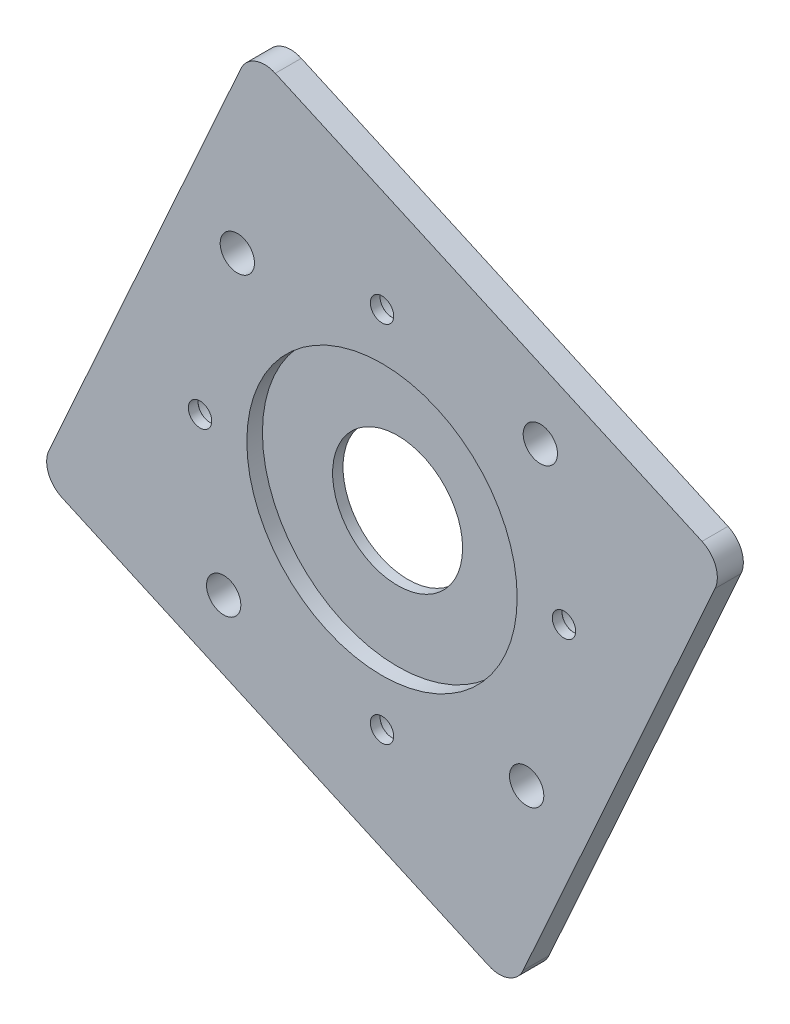
ISO-10303-21;
HEADER;
FILE_DESCRIPTION(('STEP AP214'),'2;1');
FILE_NAME('part.step','',(''),(''),'','','');
FILE_SCHEMA(('AUTOMOTIVE_DESIGN { 1 0 10303 214 1 1 1 1 }'));
ENDSEC;
DATA;
#1=APPLICATION_CONTEXT('core data for automotive mechanical design processes');
#2=APPLICATION_PROTOCOL_DEFINITION('international standard','automotive_design',2000,#1);
#3=PRODUCT_CONTEXT('',#1,'mechanical');
#4=PRODUCT('Part','Part','',(#3));
#5=PRODUCT_RELATED_PRODUCT_CATEGORY('part','',(#4));
#6=PRODUCT_DEFINITION_FORMATION('','',#4);
#7=PRODUCT_DEFINITION_CONTEXT('part definition',#1,'design');
#8=PRODUCT_DEFINITION('design','',#6,#7);
#9=PRODUCT_DEFINITION_SHAPE('','',#8);
#10=(LENGTH_UNIT() NAMED_UNIT(*) SI_UNIT(.MILLI.,.METRE.));
#11=(NAMED_UNIT(*) PLANE_ANGLE_UNIT() SI_UNIT($,.RADIAN.));
#12=(NAMED_UNIT(*) SI_UNIT($,.STERADIAN.) SOLID_ANGLE_UNIT());
#13=UNCERTAINTY_MEASURE_WITH_UNIT(LENGTH_MEASURE(1.E-05),#10,'distance_accuracy_value','');
#14=(GEOMETRIC_REPRESENTATION_CONTEXT(3) GLOBAL_UNCERTAINTY_ASSIGNED_CONTEXT((#13)) GLOBAL_UNIT_ASSIGNED_CONTEXT((#10,
#11,#12)) REPRESENTATION_CONTEXT('',''));
#15=CARTESIAN_POINT('',(0.,0.,0.));
#16=DIRECTION('',(0.,0.,1.));
#17=DIRECTION('',(1.,0.,0.));
#18=AXIS2_PLACEMENT_3D('',#15,#16,#17);
#19=CARTESIAN_POINT('',(0.,0.,5.));
#20=DIRECTION('',(0.,0.,1.));
#21=DIRECTION('',(1.,0.,0.));
#22=AXIS2_PLACEMENT_3D('',#19,#20,#21);
#23=PLANE('',#22);
#24=CARTESIAN_POINT('',(30.4526604909076,27.8244131838484,5.));
#25=DIRECTION('',(0.,0.,1.));
#26=DIRECTION('',(1.,0.,0.));
#27=AXIS2_PLACEMENT_3D('',#24,#25,#26);
#28=CIRCLE('',#27,3.29999999999998);
#29=CARTESIAN_POINT('',(33.7526604909076,27.8244131838484,5.));
#30=VERTEX_POINT('',#29);
#31=EDGE_CURVE('E203',#30,#30,#28,.T.);
#32=ORIENTED_EDGE('',*,*,#31,.F.);
#33=EDGE_LOOP('',(#32));
#34=FACE_BOUND('',#33,.T.);
#35=CARTESIAN_POINT('',(-27.8244131838484,30.4526604909076,5.));
#36=DIRECTION('',(0.,0.,1.));
#37=DIRECTION('',(1.,0.,0.));
#38=AXIS2_PLACEMENT_3D('',#35,#36,#37);
#39=CIRCLE('',#38,3.29999999999999);
#40=CARTESIAN_POINT('',(-24.5244131838484,30.4526604909076,5.));
#41=VERTEX_POINT('',#40);
#42=EDGE_CURVE('E210',#41,#41,#39,.T.);
#43=ORIENTED_EDGE('',*,*,#42,.F.);
#44=EDGE_LOOP('',(#43));
#45=FACE_BOUND('',#44,.T.);
#46=CARTESIAN_POINT('',(-30.4526604909076,-27.8244131838484,5.));
#47=DIRECTION('',(0.,0.,1.));
#48=DIRECTION('',(1.,0.,0.));
#49=AXIS2_PLACEMENT_3D('',#46,#47,#48);
#50=CIRCLE('',#49,3.29999999999999);
#51=CARTESIAN_POINT('',(-27.1526604909076,-27.8244131838484,5.));
#52=VERTEX_POINT('',#51);
#53=EDGE_CURVE('E216',#52,#52,#50,.T.);
#54=ORIENTED_EDGE('',*,*,#53,.F.);
#55=EDGE_LOOP('',(#54));
#56=FACE_BOUND('',#55,.T.);
#57=CARTESIAN_POINT('',(27.8244131838484,-30.4526604909076,5.));
#58=DIRECTION('',(0.,0.,1.));
#59=DIRECTION('',(1.,0.,0.));
#60=AXIS2_PLACEMENT_3D('',#57,#58,#59);
#61=CIRCLE('',#60,3.29999999999999);
#62=CARTESIAN_POINT('',(31.1244131838484,-30.4526604909076,5.));
#63=VERTEX_POINT('',#62);
#64=EDGE_CURVE('E222',#63,#63,#61,.T.);
#65=ORIENTED_EDGE('',*,*,#64,.F.);
#66=EDGE_LOOP('',(#65));
#67=FACE_BOUND('',#66,.T.);
#68=CARTESIAN_POINT('',(0.,35.,5.));
#69=DIRECTION('',(0.,0.,-1.));
#70=DIRECTION('',(-1.,0.,0.));
#71=AXIS2_PLACEMENT_3D('',#68,#69,#70);
#72=CIRCLE('',#71,2.25);
#73=CARTESIAN_POINT('',(-2.25,35.,5.));
#74=VERTEX_POINT('',#73);
#75=EDGE_CURVE('E240',#74,#74,#72,.T.);
#76=ORIENTED_EDGE('',*,*,#75,.T.);
#77=EDGE_LOOP('',(#76));
#78=FACE_BOUND('',#77,.T.);
#79=CARTESIAN_POINT('',(-35.,0.,5.));
#80=DIRECTION('',(0.,0.,-1.));
#81=DIRECTION('',(-1.,0.,0.));
#82=AXIS2_PLACEMENT_3D('',#79,#80,#81);
#83=CIRCLE('',#82,2.25);
#84=CARTESIAN_POINT('',(-37.25,0.,5.));
#85=VERTEX_POINT('',#84);
#86=EDGE_CURVE('E255',#85,#85,#83,.T.);
#87=ORIENTED_EDGE('',*,*,#86,.T.);
#88=EDGE_LOOP('',(#87));
#89=FACE_BOUND('',#88,.T.);
#90=CARTESIAN_POINT('',(0.,-35.,5.));
#91=DIRECTION('',(0.,0.,-1.));
#92=DIRECTION('',(-1.,0.,0.));
#93=AXIS2_PLACEMENT_3D('',#90,#91,#92);
#94=CIRCLE('',#93,2.25);
#95=CARTESIAN_POINT('',(-2.25,-35.,5.));
#96=VERTEX_POINT('',#95);
#97=EDGE_CURVE('E270',#96,#96,#94,.T.);
#98=ORIENTED_EDGE('',*,*,#97,.T.);
#99=EDGE_LOOP('',(#98));
#100=FACE_BOUND('',#99,.T.);
#101=CARTESIAN_POINT('',(35.,0.,5.));
#102=DIRECTION('',(0.,0.,-1.));
#103=DIRECTION('',(-1.,0.,0.));
#104=AXIS2_PLACEMENT_3D('',#101,#102,#103);
#105=CIRCLE('',#104,2.25);
#106=CARTESIAN_POINT('',(32.75,0.,5.));
#107=VERTEX_POINT('',#106);
#108=EDGE_CURVE('E285',#107,#107,#105,.T.);
#109=ORIENTED_EDGE('',*,*,#108,.T.);
#110=EDGE_LOOP('',(#109));
#111=FACE_BOUND('',#110,.T.);
#112=CARTESIAN_POINT('',(0.,0.,5.));
#113=DIRECTION('',(0.,0.,1.));
#114=DIRECTION('',(1.,0.,0.));
#115=AXIS2_PLACEMENT_3D('',#112,#113,#114);
#116=CIRCLE('',#115,26.);
#117=CARTESIAN_POINT('',(26.,0.,5.));
#118=VERTEX_POINT('',#117);
#119=EDGE_CURVE('E119',#118,#118,#116,.T.);
#120=ORIENTED_EDGE('',*,*,#119,.F.);
#121=EDGE_LOOP('',(#120));
#122=FACE_BOUND('',#121,.T.);
#123=DIRECTION('',(-0.91197329592772,0.410249567354717,0.));
#124=VECTOR('',#123,1.);
#125=CARTESIAN_POINT('',(-20.5124783677358,-45.598664796386,5.));
#126=LINE('',#125,#124);
#127=CARTESIAN_POINT('',(20.5263199490115,-64.0598953273482,5.));
#128=VERTEX_POINT('',#127);
#129=CARTESIAN_POINT('',(-61.5512766844832,-27.1374342654237,5.));
#130=VERTEX_POINT('',#129);
#131=EDGE_CURVE('E187',#128,#130,#126,.T.);
#132=ORIENTED_EDGE('',*,*,#131,.F.);
#133=CARTESIAN_POINT('',(22.5775677857851,-59.5000288477096,5.));
#134=DIRECTION('',(0.,0.,-1.));
#135=DIRECTION('',(-1.,0.,0.));
#136=AXIS2_PLACEMENT_3D('',#133,#134,#135);
#137=CIRCLE('',#136,4.99999999999999);
#138=CARTESIAN_POINT('',(27.1374342654237,-61.5512766844832,5.));
#139=VERTEX_POINT('',#138);
#140=EDGE_CURVE('E387',#139,#128,#137,.T.);
#141=ORIENTED_EDGE('',*,*,#140,.F.);
#142=DIRECTION('',(-0.410249567354716,-0.91197329592772,0.));
#143=VECTOR('',#142,1.);
#144=CARTESIAN_POINT('',(45.598664796386,-20.5124783677358,5.));
#145=LINE('',#144,#143);
#146=CARTESIAN_POINT('',(64.0598953273482,20.5263199490115,5.));
#147=VERTEX_POINT('',#146);
#148=EDGE_CURVE('E383',#147,#139,#145,.T.);
#149=ORIENTED_EDGE('',*,*,#148,.F.);
#150=CARTESIAN_POINT('',(59.5000288477096,22.5775677857851,5.));
#151=DIRECTION('',(0.,0.,-1.));
#152=DIRECTION('',(-1.,0.,0.));
#153=AXIS2_PLACEMENT_3D('',#150,#151,#152);
#154=CIRCLE('',#153,4.99999999999999);
#155=CARTESIAN_POINT('',(61.5512766844832,27.1374342654237,5.));
#156=VERTEX_POINT('',#155);
#157=EDGE_CURVE('E178',#156,#147,#154,.T.);
#158=ORIENTED_EDGE('',*,*,#157,.F.);
#159=DIRECTION('',(0.91197329592772,-0.410249567354717,0.));
#160=VECTOR('',#159,1.);
#161=CARTESIAN_POINT('',(20.5124783677358,45.598664796386,5.));
#162=LINE('',#161,#160);
#163=CARTESIAN_POINT('',(-20.5263199490115,64.0598953273482,5.));
#164=VERTEX_POINT('',#163);
#165=EDGE_CURVE('E164',#164,#156,#162,.T.);
#166=ORIENTED_EDGE('',*,*,#165,.F.);
#167=CARTESIAN_POINT('',(-22.5775677857851,59.5000288477096,5.));
#168=DIRECTION('',(0.,0.,-1.));
#169=DIRECTION('',(-1.,0.,0.));
#170=AXIS2_PLACEMENT_3D('',#167,#168,#169);
#171=CIRCLE('',#170,5.);
#172=CARTESIAN_POINT('',(-27.1374342654237,61.5512766844832,5.));
#173=VERTEX_POINT('',#172);
#174=EDGE_CURVE('E170',#173,#164,#171,.T.);
#175=ORIENTED_EDGE('',*,*,#174,.F.);
#176=DIRECTION('',(0.410249567354717,0.91197329592772,0.));
#177=VECTOR('',#176,1.);
#178=CARTESIAN_POINT('',(-45.598664796386,20.5124783677358,5.));
#179=LINE('',#178,#177);
#180=CARTESIAN_POINT('',(-64.0598953273482,-20.5263199490115,5.));
#181=VERTEX_POINT('',#180);
#182=EDGE_CURVE('E193',#181,#173,#179,.T.);
#183=ORIENTED_EDGE('',*,*,#182,.F.);
#184=CARTESIAN_POINT('',(-59.5000288477096,-22.5775677857851,5.));
#185=DIRECTION('',(0.,0.,-1.));
#186=DIRECTION('',(-1.,0.,0.));
#187=AXIS2_PLACEMENT_3D('',#184,#185,#186);
#188=CIRCLE('',#187,5.);
#189=EDGE_CURVE('E189',#130,#181,#188,.T.);
#190=ORIENTED_EDGE('',*,*,#189,.F.);
#191=EDGE_LOOP('',(#132,#141,#149,#158,#166,#175,#183,#190));
#192=FACE_BOUND('',#191,.T.);
#193=ADVANCED_FACE('F109',(#34,#45,#56,#67,#78,#89,#100,#111,#122,#192),#23,.T.);
#194=CARTESIAN_POINT('',(0.,0.,0.));
#195=DIRECTION('',(0.,0.,1.));
#196=DIRECTION('',(1.,0.,0.));
#197=AXIS2_PLACEMENT_3D('',#194,#195,#196);
#198=PLANE('',#197);
#199=CARTESIAN_POINT('',(30.4526604909076,27.8244131838484,0.));
#200=DIRECTION('',(0.,0.,1.));
#201=DIRECTION('',(1.,0.,0.));
#202=AXIS2_PLACEMENT_3D('',#199,#200,#201);
#203=CIRCLE('',#202,3.29999999999998);
#204=CARTESIAN_POINT('',(33.7526604909076,27.8244131838484,0.));
#205=VERTEX_POINT('',#204);
#206=EDGE_CURVE('E207',#205,#205,#203,.T.);
#207=ORIENTED_EDGE('',*,*,#206,.T.);
#208=EDGE_LOOP('',(#207));
#209=FACE_BOUND('',#208,.T.);
#210=CARTESIAN_POINT('',(-27.8244131838484,30.4526604909076,0.));
#211=DIRECTION('',(0.,0.,1.));
#212=DIRECTION('',(1.,0.,0.));
#213=AXIS2_PLACEMENT_3D('',#210,#211,#212);
#214=CIRCLE('',#213,3.29999999999999);
#215=CARTESIAN_POINT('',(-24.5244131838484,30.4526604909076,0.));
#216=VERTEX_POINT('',#215);
#217=EDGE_CURVE('E213',#216,#216,#214,.T.);
#218=ORIENTED_EDGE('',*,*,#217,.T.);
#219=EDGE_LOOP('',(#218));
#220=FACE_BOUND('',#219,.T.);
#221=CARTESIAN_POINT('',(-30.4526604909076,-27.8244131838484,0.));
#222=DIRECTION('',(0.,0.,1.));
#223=DIRECTION('',(1.,0.,0.));
#224=AXIS2_PLACEMENT_3D('',#221,#222,#223);
#225=CIRCLE('',#224,3.29999999999999);
#226=CARTESIAN_POINT('',(-27.1526604909076,-27.8244131838484,0.));
#227=VERTEX_POINT('',#226);
#228=EDGE_CURVE('E219',#227,#227,#225,.T.);
#229=ORIENTED_EDGE('',*,*,#228,.T.);
#230=EDGE_LOOP('',(#229));
#231=FACE_BOUND('',#230,.T.);
#232=CARTESIAN_POINT('',(27.8244131838484,-30.4526604909076,0.));
#233=DIRECTION('',(0.,0.,1.));
#234=DIRECTION('',(1.,0.,0.));
#235=AXIS2_PLACEMENT_3D('',#232,#233,#234);
#236=CIRCLE('',#235,3.29999999999999);
#237=CARTESIAN_POINT('',(31.1244131838484,-30.4526604909076,0.));
#238=VERTEX_POINT('',#237);
#239=EDGE_CURVE('E225',#238,#238,#236,.T.);
#240=ORIENTED_EDGE('',*,*,#239,.T.);
#241=EDGE_LOOP('',(#240));
#242=FACE_BOUND('',#241,.T.);
#243=CARTESIAN_POINT('',(0.,35.,0.));
#244=DIRECTION('',(0.,0.,-1.));
#245=DIRECTION('',(-1.,0.,0.));
#246=AXIS2_PLACEMENT_3D('',#243,#244,#245);
#247=CIRCLE('',#246,4.5);
#248=CARTESIAN_POINT('',(-4.5,35.,0.));
#249=VERTEX_POINT('',#248);
#250=EDGE_CURVE('E228',#249,#249,#247,.T.);
#251=ORIENTED_EDGE('',*,*,#250,.F.);
#252=EDGE_LOOP('',(#251));
#253=FACE_BOUND('',#252,.T.);
#254=CARTESIAN_POINT('',(-35.,0.,0.));
#255=DIRECTION('',(0.,0.,-1.));
#256=DIRECTION('',(-1.,0.,0.));
#257=AXIS2_PLACEMENT_3D('',#254,#255,#256);
#258=CIRCLE('',#257,4.5);
#259=CARTESIAN_POINT('',(-39.5,0.,0.));
#260=VERTEX_POINT('',#259);
#261=EDGE_CURVE('E243',#260,#260,#258,.T.);
#262=ORIENTED_EDGE('',*,*,#261,.F.);
#263=EDGE_LOOP('',(#262));
#264=FACE_BOUND('',#263,.T.);
#265=CARTESIAN_POINT('',(0.,-35.,0.));
#266=DIRECTION('',(0.,0.,-1.));
#267=DIRECTION('',(-1.,0.,0.));
#268=AXIS2_PLACEMENT_3D('',#265,#266,#267);
#269=CIRCLE('',#268,4.5);
#270=CARTESIAN_POINT('',(-4.5,-35.,0.));
#271=VERTEX_POINT('',#270);
#272=EDGE_CURVE('E258',#271,#271,#269,.T.);
#273=ORIENTED_EDGE('',*,*,#272,.F.);
#274=EDGE_LOOP('',(#273));
#275=FACE_BOUND('',#274,.T.);
#276=CARTESIAN_POINT('',(35.,0.,0.));
#277=DIRECTION('',(0.,0.,-1.));
#278=DIRECTION('',(-1.,0.,0.));
#279=AXIS2_PLACEMENT_3D('',#276,#277,#278);
#280=CIRCLE('',#279,4.5);
#281=CARTESIAN_POINT('',(30.5,0.,0.));
#282=VERTEX_POINT('',#281);
#283=EDGE_CURVE('E273',#282,#282,#280,.T.);
#284=ORIENTED_EDGE('',*,*,#283,.F.);
#285=EDGE_LOOP('',(#284));
#286=FACE_BOUND('',#285,.T.);
#287=CARTESIAN_POINT('',(0.,0.,0.));
#288=DIRECTION('',(0.,0.,1.));
#289=DIRECTION('',(1.,0.,0.));
#290=AXIS2_PLACEMENT_3D('',#287,#288,#289);
#291=CIRCLE('',#290,12.5);
#292=CARTESIAN_POINT('',(12.5,0.,0.));
#293=VERTEX_POINT('',#292);
#294=EDGE_CURVE('E288',#293,#293,#291,.T.);
#295=ORIENTED_EDGE('',*,*,#294,.T.);
#296=EDGE_LOOP('',(#295));
#297=FACE_BOUND('',#296,.T.);
#298=DIRECTION('',(-0.410249567354716,-0.91197329592772,0.));
#299=VECTOR('',#298,1.);
#300=CARTESIAN_POINT('',(45.598664796386,-20.5124783677358,0.));
#301=LINE('',#300,#299);
#302=CARTESIAN_POINT('',(64.0598953273482,20.5263199490115,0.));
#303=VERTEX_POINT('',#302);
#304=CARTESIAN_POINT('',(27.1374342654237,-61.5512766844832,0.));
#305=VERTEX_POINT('',#304);
#306=EDGE_CURVE('E366',#303,#305,#301,.T.);
#307=ORIENTED_EDGE('',*,*,#306,.T.);
#308=CARTESIAN_POINT('',(22.5775677857851,-59.5000288477096,0.));
#309=DIRECTION('',(0.,0.,-1.));
#310=DIRECTION('',(-1.,0.,0.));
#311=AXIS2_PLACEMENT_3D('',#308,#309,#310);
#312=CIRCLE('',#311,4.99999999999999);
#313=CARTESIAN_POINT('',(20.5263199490115,-64.0598953273482,0.));
#314=VERTEX_POINT('',#313);
#315=EDGE_CURVE('E370',#305,#314,#312,.T.);
#316=ORIENTED_EDGE('',*,*,#315,.T.);
#317=DIRECTION('',(-0.91197329592772,0.410249567354717,0.));
#318=VECTOR('',#317,1.);
#319=CARTESIAN_POINT('',(-20.5124783677358,-45.598664796386,0.));
#320=LINE('',#319,#318);
#321=CARTESIAN_POINT('',(-61.5512766844832,-27.1374342654237,0.));
#322=VERTEX_POINT('',#321);
#323=EDGE_CURVE('E195',#314,#322,#320,.T.);
#324=ORIENTED_EDGE('',*,*,#323,.T.);
#325=CARTESIAN_POINT('',(-59.5000288477096,-22.5775677857851,0.));
#326=DIRECTION('',(0.,0.,-1.));
#327=DIRECTION('',(-1.,0.,0.));
#328=AXIS2_PLACEMENT_3D('',#325,#326,#327);
#329=CIRCLE('',#328,5.);
#330=CARTESIAN_POINT('',(-64.0598953273482,-20.5263199490115,0.));
#331=VERTEX_POINT('',#330);
#332=EDGE_CURVE('E198',#322,#331,#329,.T.);
#333=ORIENTED_EDGE('',*,*,#332,.T.);
#334=DIRECTION('',(0.410249567354717,0.91197329592772,0.));
#335=VECTOR('',#334,1.);
#336=CARTESIAN_POINT('',(-45.598664796386,20.5124783677358,0.));
#337=LINE('',#336,#335);
#338=CARTESIAN_POINT('',(-27.1374342654237,61.5512766844832,0.));
#339=VERTEX_POINT('',#338);
#340=EDGE_CURVE('E190',#331,#339,#337,.T.);
#341=ORIENTED_EDGE('',*,*,#340,.T.);
#342=CARTESIAN_POINT('',(-22.5775677857851,59.5000288477096,0.));
#343=DIRECTION('',(0.,0.,-1.));
#344=DIRECTION('',(-1.,0.,0.));
#345=AXIS2_PLACEMENT_3D('',#342,#343,#344);
#346=CIRCLE('',#345,5.);
#347=CARTESIAN_POINT('',(-20.5263199490115,64.0598953273482,0.));
#348=VERTEX_POINT('',#347);
#349=EDGE_CURVE('E169',#339,#348,#346,.T.);
#350=ORIENTED_EDGE('',*,*,#349,.T.);
#351=DIRECTION('',(0.91197329592772,-0.410249567354717,0.));
#352=VECTOR('',#351,1.);
#353=CARTESIAN_POINT('',(20.5124783677358,45.598664796386,0.));
#354=LINE('',#353,#352);
#355=CARTESIAN_POINT('',(61.5512766844832,27.1374342654237,0.));
#356=VERTEX_POINT('',#355);
#357=EDGE_CURVE('E167',#348,#356,#354,.T.);
#358=ORIENTED_EDGE('',*,*,#357,.T.);
#359=CARTESIAN_POINT('',(59.5000288477096,22.5775677857851,0.));
#360=DIRECTION('',(0.,0.,-1.));
#361=DIRECTION('',(-1.,0.,0.));
#362=AXIS2_PLACEMENT_3D('',#359,#360,#361);
#363=CIRCLE('',#362,4.99999999999999);
#364=EDGE_CURVE('E372',#356,#303,#363,.T.);
#365=ORIENTED_EDGE('',*,*,#364,.T.);
#366=EDGE_LOOP('',(#307,#316,#324,#333,#341,#350,#358,#365));
#367=FACE_BOUND('',#366,.T.);
#368=ADVANCED_FACE('F111',(#209,#220,#231,#242,#253,#264,#275,#286,#297,#367),#198,.F.);
#369=CARTESIAN_POINT('',(0.,0.,2.));
#370=DIRECTION('',(0.,0.,1.));
#371=DIRECTION('',(1.,0.,0.));
#372=AXIS2_PLACEMENT_3D('',#369,#370,#371);
#373=CYLINDRICAL_SURFACE('',#372,26.);
#374=CARTESIAN_POINT('',(0.,0.,2.));
#375=DIRECTION('',(0.,0.,1.));
#376=DIRECTION('',(1.,0.,0.));
#377=AXIS2_PLACEMENT_3D('',#374,#375,#376);
#378=CIRCLE('',#377,26.);
#379=CARTESIAN_POINT('',(26.,0.,2.));
#380=VERTEX_POINT('',#379);
#381=EDGE_CURVE('E12',#380,#380,#378,.T.);
#382=ORIENTED_EDGE('',*,*,#381,.F.);
#383=EDGE_LOOP('',(#382));
#384=FACE_BOUND('',#383,.T.);
#385=ORIENTED_EDGE('',*,*,#119,.T.);
#386=EDGE_LOOP('',(#385));
#387=FACE_BOUND('',#386,.T.);
#388=ADVANCED_FACE('F302',(#384,#387),#373,.F.);
#389=CARTESIAN_POINT('',(0.,0.,2.));
#390=DIRECTION('',(0.,0.,1.));
#391=DIRECTION('',(1.,0.,0.));
#392=AXIS2_PLACEMENT_3D('',#389,#390,#391);
#393=PLANE('',#392);
#394=CARTESIAN_POINT('',(0.,0.,2.));
#395=DIRECTION('',(0.,0.,1.));
#396=DIRECTION('',(1.,0.,0.));
#397=AXIS2_PLACEMENT_3D('',#394,#395,#396);
#398=CIRCLE('',#397,12.5);
#399=CARTESIAN_POINT('',(12.5,0.,2.));
#400=VERTEX_POINT('',#399);
#401=EDGE_CURVE('E113',#400,#400,#398,.T.);
#402=ORIENTED_EDGE('',*,*,#401,.F.);
#403=EDGE_LOOP('',(#402));
#404=FACE_BOUND('',#403,.T.);
#405=ORIENTED_EDGE('',*,*,#381,.T.);
#406=EDGE_LOOP('',(#405));
#407=FACE_BOUND('',#406,.T.);
#408=ADVANCED_FACE('F299',(#404,#407),#393,.T.);
#409=CARTESIAN_POINT('',(0.,0.,0.));
#410=DIRECTION('',(0.,0.,1.));
#411=DIRECTION('',(1.,0.,0.));
#412=AXIS2_PLACEMENT_3D('',#409,#410,#411);
#413=CYLINDRICAL_SURFACE('',#412,12.5);
#414=ORIENTED_EDGE('',*,*,#401,.T.);
#415=EDGE_LOOP('',(#414));
#416=FACE_BOUND('',#415,.T.);
#417=ORIENTED_EDGE('',*,*,#294,.F.);
#418=EDGE_LOOP('',(#417));
#419=FACE_BOUND('',#418,.T.);
#420=ADVANCED_FACE('F296',(#416,#419),#413,.F.);
#421=CARTESIAN_POINT('',(35.,0.,0.));
#422=DIRECTION('',(0.,0.,-1.));
#423=DIRECTION('',(-1.,0.,0.));
#424=AXIS2_PLACEMENT_3D('',#421,#422,#423);
#425=CYLINDRICAL_SURFACE('',#424,2.25);
#426=ORIENTED_EDGE('',*,*,#108,.F.);
#427=EDGE_LOOP('',(#426));
#428=FACE_BOUND('',#427,.T.);
#429=CARTESIAN_POINT('',(35.,0.,3.125));
#430=DIRECTION('',(0.,0.,-1.));
#431=DIRECTION('',(-1.,0.,0.));
#432=AXIS2_PLACEMENT_3D('',#429,#430,#431);
#433=CIRCLE('',#432,2.25);
#434=CARTESIAN_POINT('',(32.75,0.,3.125));
#435=VERTEX_POINT('',#434);
#436=EDGE_CURVE('E282',#435,#435,#433,.T.);
#437=ORIENTED_EDGE('',*,*,#436,.T.);
#438=EDGE_LOOP('',(#437));
#439=FACE_BOUND('',#438,.T.);
#440=ADVANCED_FACE('F333',(#428,#439),#425,.F.);
#441=CARTESIAN_POINT('',(35.,0.,3.1));
#442=DIRECTION('',(0.,0.,-1.));
#443=DIRECTION('',(-1.,0.,0.));
#444=AXIS2_PLACEMENT_3D('',#441,#442,#443);
#445=CONICAL_SURFACE('',#444,2.275,0.785398163397396);
#446=ORIENTED_EDGE('',*,*,#436,.F.);
#447=EDGE_LOOP('',(#446));
#448=FACE_BOUND('',#447,.T.);
#449=CARTESIAN_POINT('',(35.,0.,3.1));
#450=DIRECTION('',(0.,0.,-1.));
#451=DIRECTION('',(-1.,0.,0.));
#452=AXIS2_PLACEMENT_3D('',#449,#450,#451);
#453=CIRCLE('',#452,2.275);
#454=CARTESIAN_POINT('',(32.725,0.,3.1));
#455=VERTEX_POINT('',#454);
#456=EDGE_CURVE('E279',#455,#455,#453,.T.);
#457=ORIENTED_EDGE('',*,*,#456,.T.);
#458=EDGE_LOOP('',(#457));
#459=FACE_BOUND('',#458,.T.);
#460=ADVANCED_FACE('F336',(#448,#459),#445,.F.);
#461=CARTESIAN_POINT('',(37.275,0.,3.1));
#462=DIRECTION('',(0.,0.,1.));
#463=DIRECTION('',(1.,0.,0.));
#464=AXIS2_PLACEMENT_3D('',#461,#462,#463);
#465=PLANE('',#464);
#466=ORIENTED_EDGE('',*,*,#456,.F.);
#467=EDGE_LOOP('',(#466));
#468=FACE_BOUND('',#467,.T.);
#469=CARTESIAN_POINT('',(35.,0.,3.1));
#470=DIRECTION('',(0.,0.,-1.));
#471=DIRECTION('',(-1.,0.,0.));
#472=AXIS2_PLACEMENT_3D('',#469,#470,#471);
#473=CIRCLE('',#472,4.5);
#474=CARTESIAN_POINT('',(30.5,0.,3.1));
#475=VERTEX_POINT('',#474);
#476=EDGE_CURVE('E276',#475,#475,#473,.T.);
#477=ORIENTED_EDGE('',*,*,#476,.T.);
#478=EDGE_LOOP('',(#477));
#479=FACE_BOUND('',#478,.T.);
#480=ADVANCED_FACE('F342',(#468,#479),#465,.F.);
#481=CARTESIAN_POINT('',(35.,0.,0.));
#482=DIRECTION('',(0.,0.,-1.));
#483=DIRECTION('',(-1.,0.,0.));
#484=AXIS2_PLACEMENT_3D('',#481,#482,#483);
#485=CYLINDRICAL_SURFACE('',#484,4.5);
#486=ORIENTED_EDGE('',*,*,#476,.F.);
#487=EDGE_LOOP('',(#486));
#488=FACE_BOUND('',#487,.T.);
#489=ORIENTED_EDGE('',*,*,#283,.T.);
#490=EDGE_LOOP('',(#489));
#491=FACE_BOUND('',#490,.T.);
#492=ADVANCED_FACE('F348',(#488,#491),#485,.F.);
#493=CARTESIAN_POINT('',(0.,-35.,0.));
#494=DIRECTION('',(0.,0.,-1.));
#495=DIRECTION('',(-1.,0.,0.));
#496=AXIS2_PLACEMENT_3D('',#493,#494,#495);
#497=CYLINDRICAL_SURFACE('',#496,2.25);
#498=ORIENTED_EDGE('',*,*,#97,.F.);
#499=EDGE_LOOP('',(#498));
#500=FACE_BOUND('',#499,.T.);
#501=CARTESIAN_POINT('',(0.,-35.,3.125));
#502=DIRECTION('',(0.,0.,-1.));
#503=DIRECTION('',(-1.,0.,0.));
#504=AXIS2_PLACEMENT_3D('',#501,#502,#503);
#505=CIRCLE('',#504,2.25);
#506=CARTESIAN_POINT('',(-2.25,-35.,3.125));
#507=VERTEX_POINT('',#506);
#508=EDGE_CURVE('E267',#507,#507,#505,.T.);
#509=ORIENTED_EDGE('',*,*,#508,.T.);
#510=EDGE_LOOP('',(#509));
#511=FACE_BOUND('',#510,.T.);
#512=ADVANCED_FACE('F354',(#500,#511),#497,.F.);
#513=CARTESIAN_POINT('',(0.,-35.,3.1));
#514=DIRECTION('',(0.,0.,-1.));
#515=DIRECTION('',(-1.,0.,0.));
#516=AXIS2_PLACEMENT_3D('',#513,#514,#515);
#517=CONICAL_SURFACE('',#516,2.275,0.785398163397448);
#518=ORIENTED_EDGE('',*,*,#508,.F.);
#519=EDGE_LOOP('',(#518));
#520=FACE_BOUND('',#519,.T.);
#521=CARTESIAN_POINT('',(0.,-35.,3.1));
#522=DIRECTION('',(0.,0.,-1.));
#523=DIRECTION('',(-1.,0.,0.));
#524=AXIS2_PLACEMENT_3D('',#521,#522,#523);
#525=CIRCLE('',#524,2.275);
#526=CARTESIAN_POINT('',(-2.275,-35.,3.1));
#527=VERTEX_POINT('',#526);
#528=EDGE_CURVE('E264',#527,#527,#525,.T.);
#529=ORIENTED_EDGE('',*,*,#528,.T.);
#530=EDGE_LOOP('',(#529));
#531=FACE_BOUND('',#530,.T.);
#532=ADVANCED_FACE('F494',(#520,#531),#517,.F.);
#533=CARTESIAN_POINT('',(2.275,-35.,3.1));
#534=DIRECTION('',(0.,0.,1.));
#535=DIRECTION('',(1.,0.,0.));
#536=AXIS2_PLACEMENT_3D('',#533,#534,#535);
#537=PLANE('',#536);
#538=ORIENTED_EDGE('',*,*,#528,.F.);
#539=EDGE_LOOP('',(#538));
#540=FACE_BOUND('',#539,.T.);
#541=CARTESIAN_POINT('',(0.,-35.,3.1));
#542=DIRECTION('',(0.,0.,-1.));
#543=DIRECTION('',(-1.,0.,0.));
#544=AXIS2_PLACEMENT_3D('',#541,#542,#543);
#545=CIRCLE('',#544,4.5);
#546=CARTESIAN_POINT('',(-4.5,-35.,3.1));
#547=VERTEX_POINT('',#546);
#548=EDGE_CURVE('E261',#547,#547,#545,.T.);
#549=ORIENTED_EDGE('',*,*,#548,.T.);
#550=EDGE_LOOP('',(#549));
#551=FACE_BOUND('',#550,.T.);
#552=ADVANCED_FACE('F490',(#540,#551),#537,.F.);
#553=CARTESIAN_POINT('',(0.,-35.,0.));
#554=DIRECTION('',(0.,0.,-1.));
#555=DIRECTION('',(-1.,0.,0.));
#556=AXIS2_PLACEMENT_3D('',#553,#554,#555);
#557=CYLINDRICAL_SURFACE('',#556,4.5);
#558=ORIENTED_EDGE('',*,*,#548,.F.);
#559=EDGE_LOOP('',(#558));
#560=FACE_BOUND('',#559,.T.);
#561=ORIENTED_EDGE('',*,*,#272,.T.);
#562=EDGE_LOOP('',(#561));
#563=FACE_BOUND('',#562,.T.);
#564=ADVANCED_FACE('F486',(#560,#563),#557,.F.);
#565=CARTESIAN_POINT('',(-35.,0.,0.));
#566=DIRECTION('',(0.,0.,-1.));
#567=DIRECTION('',(-1.,0.,0.));
#568=AXIS2_PLACEMENT_3D('',#565,#566,#567);
#569=CYLINDRICAL_SURFACE('',#568,2.25);
#570=ORIENTED_EDGE('',*,*,#86,.F.);
#571=EDGE_LOOP('',(#570));
#572=FACE_BOUND('',#571,.T.);
#573=CARTESIAN_POINT('',(-35.,0.,3.125));
#574=DIRECTION('',(0.,0.,-1.));
#575=DIRECTION('',(-1.,0.,0.));
#576=AXIS2_PLACEMENT_3D('',#573,#574,#575);
#577=CIRCLE('',#576,2.25);
#578=CARTESIAN_POINT('',(-37.25,0.,3.125));
#579=VERTEX_POINT('',#578);
#580=EDGE_CURVE('E252',#579,#579,#577,.T.);
#581=ORIENTED_EDGE('',*,*,#580,.T.);
#582=EDGE_LOOP('',(#581));
#583=FACE_BOUND('',#582,.T.);
#584=ADVANCED_FACE('F482',(#572,#583),#569,.F.);
#585=CARTESIAN_POINT('',(-35.,0.,3.1));
#586=DIRECTION('',(0.,0.,-1.));
#587=DIRECTION('',(-1.,0.,0.));
#588=AXIS2_PLACEMENT_3D('',#585,#586,#587);
#589=CONICAL_SURFACE('',#588,2.275,0.785398163397396);
#590=ORIENTED_EDGE('',*,*,#580,.F.);
#591=EDGE_LOOP('',(#590));
#592=FACE_BOUND('',#591,.T.);
#593=CARTESIAN_POINT('',(-35.,0.,3.1));
#594=DIRECTION('',(0.,0.,-1.));
#595=DIRECTION('',(-1.,0.,0.));
#596=AXIS2_PLACEMENT_3D('',#593,#594,#595);
#597=CIRCLE('',#596,2.275);
#598=CARTESIAN_POINT('',(-37.275,0.,3.1));
#599=VERTEX_POINT('',#598);
#600=EDGE_CURVE('E249',#599,#599,#597,.T.);
#601=ORIENTED_EDGE('',*,*,#600,.T.);
#602=EDGE_LOOP('',(#601));
#603=FACE_BOUND('',#602,.T.);
#604=ADVANCED_FACE('F478',(#592,#603),#589,.F.);
#605=CARTESIAN_POINT('',(-32.725,0.,3.1));
#606=DIRECTION('',(0.,0.,1.));
#607=DIRECTION('',(1.,0.,0.));
#608=AXIS2_PLACEMENT_3D('',#605,#606,#607);
#609=PLANE('',#608);
#610=ORIENTED_EDGE('',*,*,#600,.F.);
#611=EDGE_LOOP('',(#610));
#612=FACE_BOUND('',#611,.T.);
#613=CARTESIAN_POINT('',(-35.,0.,3.1));
#614=DIRECTION('',(0.,0.,-1.));
#615=DIRECTION('',(-1.,0.,0.));
#616=AXIS2_PLACEMENT_3D('',#613,#614,#615);
#617=CIRCLE('',#616,4.5);
#618=CARTESIAN_POINT('',(-39.5,0.,3.1));
#619=VERTEX_POINT('',#618);
#620=EDGE_CURVE('E246',#619,#619,#617,.T.);
#621=ORIENTED_EDGE('',*,*,#620,.T.);
#622=EDGE_LOOP('',(#621));
#623=FACE_BOUND('',#622,.T.);
#624=ADVANCED_FACE('F474',(#612,#623),#609,.F.);
#625=CARTESIAN_POINT('',(-35.,0.,0.));
#626=DIRECTION('',(0.,0.,-1.));
#627=DIRECTION('',(-1.,0.,0.));
#628=AXIS2_PLACEMENT_3D('',#625,#626,#627);
#629=CYLINDRICAL_SURFACE('',#628,4.5);
#630=ORIENTED_EDGE('',*,*,#620,.F.);
#631=EDGE_LOOP('',(#630));
#632=FACE_BOUND('',#631,.T.);
#633=ORIENTED_EDGE('',*,*,#261,.T.);
#634=EDGE_LOOP('',(#633));
#635=FACE_BOUND('',#634,.T.);
#636=ADVANCED_FACE('F470',(#632,#635),#629,.F.);
#637=CARTESIAN_POINT('',(0.,35.,0.));
#638=DIRECTION('',(0.,0.,-1.));
#639=DIRECTION('',(-1.,0.,0.));
#640=AXIS2_PLACEMENT_3D('',#637,#638,#639);
#641=CYLINDRICAL_SURFACE('',#640,2.25);
#642=ORIENTED_EDGE('',*,*,#75,.F.);
#643=EDGE_LOOP('',(#642));
#644=FACE_BOUND('',#643,.T.);
#645=CARTESIAN_POINT('',(0.,35.,3.125));
#646=DIRECTION('',(0.,0.,-1.));
#647=DIRECTION('',(-1.,0.,0.));
#648=AXIS2_PLACEMENT_3D('',#645,#646,#647);
#649=CIRCLE('',#648,2.25);
#650=CARTESIAN_POINT('',(-2.25,35.,3.125));
#651=VERTEX_POINT('',#650);
#652=EDGE_CURVE('E237',#651,#651,#649,.T.);
#653=ORIENTED_EDGE('',*,*,#652,.T.);
#654=EDGE_LOOP('',(#653));
#655=FACE_BOUND('',#654,.T.);
#656=ADVANCED_FACE('F466',(#644,#655),#641,.F.);
#657=CARTESIAN_POINT('',(0.,35.,3.1));
#658=DIRECTION('',(0.,0.,-1.));
#659=DIRECTION('',(-1.,0.,0.));
#660=AXIS2_PLACEMENT_3D('',#657,#658,#659);
#661=CONICAL_SURFACE('',#660,2.275,0.785398163397448);
#662=ORIENTED_EDGE('',*,*,#652,.F.);
#663=EDGE_LOOP('',(#662));
#664=FACE_BOUND('',#663,.T.);
#665=CARTESIAN_POINT('',(0.,35.,3.1));
#666=DIRECTION('',(0.,0.,-1.));
#667=DIRECTION('',(-1.,0.,0.));
#668=AXIS2_PLACEMENT_3D('',#665,#666,#667);
#669=CIRCLE('',#668,2.275);
#670=CARTESIAN_POINT('',(-2.275,35.,3.1));
#671=VERTEX_POINT('',#670);
#672=EDGE_CURVE('E234',#671,#671,#669,.T.);
#673=ORIENTED_EDGE('',*,*,#672,.T.);
#674=EDGE_LOOP('',(#673));
#675=FACE_BOUND('',#674,.T.);
#676=ADVANCED_FACE('F462',(#664,#675),#661,.F.);
#677=CARTESIAN_POINT('',(2.275,35.,3.1));
#678=DIRECTION('',(0.,0.,1.));
#679=DIRECTION('',(1.,0.,0.));
#680=AXIS2_PLACEMENT_3D('',#677,#678,#679);
#681=PLANE('',#680);
#682=ORIENTED_EDGE('',*,*,#672,.F.);
#683=EDGE_LOOP('',(#682));
#684=FACE_BOUND('',#683,.T.);
#685=CARTESIAN_POINT('',(0.,35.,3.1));
#686=DIRECTION('',(0.,0.,-1.));
#687=DIRECTION('',(-1.,0.,0.));
#688=AXIS2_PLACEMENT_3D('',#685,#686,#687);
#689=CIRCLE('',#688,4.5);
#690=CARTESIAN_POINT('',(-4.5,35.,3.1));
#691=VERTEX_POINT('',#690);
#692=EDGE_CURVE('E231',#691,#691,#689,.T.);
#693=ORIENTED_EDGE('',*,*,#692,.T.);
#694=EDGE_LOOP('',(#693));
#695=FACE_BOUND('',#694,.T.);
#696=ADVANCED_FACE('F458',(#684,#695),#681,.F.);
#697=CARTESIAN_POINT('',(0.,35.,0.));
#698=DIRECTION('',(0.,0.,-1.));
#699=DIRECTION('',(-1.,0.,0.));
#700=AXIS2_PLACEMENT_3D('',#697,#698,#699);
#701=CYLINDRICAL_SURFACE('',#700,4.5);
#702=ORIENTED_EDGE('',*,*,#692,.F.);
#703=EDGE_LOOP('',(#702));
#704=FACE_BOUND('',#703,.T.);
#705=ORIENTED_EDGE('',*,*,#250,.T.);
#706=EDGE_LOOP('',(#705));
#707=FACE_BOUND('',#706,.T.);
#708=ADVANCED_FACE('F454',(#704,#707),#701,.F.);
#709=CARTESIAN_POINT('',(27.8244131838484,-30.4526604909076,5.));
#710=DIRECTION('',(0.,0.,1.));
#711=DIRECTION('',(1.,0.,0.));
#712=AXIS2_PLACEMENT_3D('',#709,#710,#711);
#713=CYLINDRICAL_SURFACE('',#712,3.29999999999999);
#714=ORIENTED_EDGE('',*,*,#239,.F.);
#715=EDGE_LOOP('',(#714));
#716=FACE_BOUND('',#715,.T.);
#717=ORIENTED_EDGE('',*,*,#64,.T.);
#718=EDGE_LOOP('',(#717));
#719=FACE_BOUND('',#718,.T.);
#720=ADVANCED_FACE('F450',(#716,#719),#713,.F.);
#721=CARTESIAN_POINT('',(-30.4526604909076,-27.8244131838484,5.));
#722=DIRECTION('',(0.,0.,1.));
#723=DIRECTION('',(1.,0.,0.));
#724=AXIS2_PLACEMENT_3D('',#721,#722,#723);
#725=CYLINDRICAL_SURFACE('',#724,3.29999999999999);
#726=ORIENTED_EDGE('',*,*,#228,.F.);
#727=EDGE_LOOP('',(#726));
#728=FACE_BOUND('',#727,.T.);
#729=ORIENTED_EDGE('',*,*,#53,.T.);
#730=EDGE_LOOP('',(#729));
#731=FACE_BOUND('',#730,.T.);
#732=ADVANCED_FACE('F446',(#728,#731),#725,.F.);
#733=CARTESIAN_POINT('',(-27.8244131838484,30.4526604909076,5.));
#734=DIRECTION('',(0.,0.,1.));
#735=DIRECTION('',(1.,0.,0.));
#736=AXIS2_PLACEMENT_3D('',#733,#734,#735);
#737=CYLINDRICAL_SURFACE('',#736,3.29999999999999);
#738=ORIENTED_EDGE('',*,*,#217,.F.);
#739=EDGE_LOOP('',(#738));
#740=FACE_BOUND('',#739,.T.);
#741=ORIENTED_EDGE('',*,*,#42,.T.);
#742=EDGE_LOOP('',(#741));
#743=FACE_BOUND('',#742,.T.);
#744=ADVANCED_FACE('F442',(#740,#743),#737,.F.);
#745=CARTESIAN_POINT('',(30.4526604909076,27.8244131838484,5.));
#746=DIRECTION('',(0.,0.,1.));
#747=DIRECTION('',(1.,0.,0.));
#748=AXIS2_PLACEMENT_3D('',#745,#746,#747);
#749=CYLINDRICAL_SURFACE('',#748,3.29999999999998);
#750=ORIENTED_EDGE('',*,*,#206,.F.);
#751=EDGE_LOOP('',(#750));
#752=FACE_BOUND('',#751,.T.);
#753=ORIENTED_EDGE('',*,*,#31,.T.);
#754=EDGE_LOOP('',(#753));
#755=FACE_BOUND('',#754,.T.);
#756=ADVANCED_FACE('F439',(#752,#755),#749,.F.);
#757=CARTESIAN_POINT('',(-20.5124783677358,-45.598664796386,5.));
#758=DIRECTION('',(-0.410249567354717,-0.91197329592772,0.));
#759=DIRECTION('',(0.911973295927719,-0.410249567354717,0.));
#760=AXIS2_PLACEMENT_3D('',#757,#758,#759);
#761=PLANE('',#760);
#762=ORIENTED_EDGE('',*,*,#323,.F.);
#763=DIRECTION('',(0.,0.,-1.));
#764=VECTOR('',#763,1.);
#765=CARTESIAN_POINT('',(20.5263199490115,-64.0598953273482,5.));
#766=LINE('',#765,#764);
#767=EDGE_CURVE('E392',#128,#314,#766,.T.);
#768=ORIENTED_EDGE('',*,*,#767,.F.);
#769=ORIENTED_EDGE('',*,*,#131,.T.);
#770=DIRECTION('',(0.,0.,-1.));
#771=VECTOR('',#770,1.);
#772=CARTESIAN_POINT('',(-61.5512766844832,-27.1374342654237,5.));
#773=LINE('',#772,#771);
#774=EDGE_CURVE('E139',#130,#322,#773,.T.);
#775=ORIENTED_EDGE('',*,*,#774,.T.);
#776=EDGE_LOOP('',(#762,#768,#769,#775));
#777=FACE_BOUND('',#776,.T.);
#778=ADVANCED_FACE('F411',(#777),#761,.T.);
#779=CARTESIAN_POINT('',(-45.598664796386,20.5124783677358,5.));
#780=DIRECTION('',(-0.91197329592772,0.410249567354717,0.));
#781=DIRECTION('',(-0.410249567354717,-0.911973295927719,0.));
#782=AXIS2_PLACEMENT_3D('',#779,#780,#781);
#783=PLANE('',#782);
#784=ORIENTED_EDGE('',*,*,#340,.F.);
#785=DIRECTION('',(0.,0.,-1.));
#786=VECTOR('',#785,1.);
#787=CARTESIAN_POINT('',(-64.0598953273482,-20.5263199490115,5.));
#788=LINE('',#787,#786);
#789=EDGE_CURVE('E128',#181,#331,#788,.T.);
#790=ORIENTED_EDGE('',*,*,#789,.F.);
#791=ORIENTED_EDGE('',*,*,#182,.T.);
#792=DIRECTION('',(0.,0.,-1.));
#793=VECTOR('',#792,1.);
#794=CARTESIAN_POINT('',(-27.1374342654237,61.5512766844832,5.));
#795=LINE('',#794,#793);
#796=EDGE_CURVE('E179',#173,#339,#795,.T.);
#797=ORIENTED_EDGE('',*,*,#796,.T.);
#798=EDGE_LOOP('',(#784,#790,#791,#797));
#799=FACE_BOUND('',#798,.T.);
#800=ADVANCED_FACE('F407',(#799),#783,.T.);
#801=CARTESIAN_POINT('',(-59.5000288477096,-22.5775677857851,5.));
#802=DIRECTION('',(0.,0.,-1.));
#803=DIRECTION('',(-1.,0.,0.));
#804=AXIS2_PLACEMENT_3D('',#801,#802,#803);
#805=CYLINDRICAL_SURFACE('',#804,5.);
#806=ORIENTED_EDGE('',*,*,#332,.F.);
#807=ORIENTED_EDGE('',*,*,#774,.F.);
#808=ORIENTED_EDGE('',*,*,#189,.T.);
#809=ORIENTED_EDGE('',*,*,#789,.T.);
#810=EDGE_LOOP('',(#806,#807,#808,#809));
#811=FACE_BOUND('',#810,.T.);
#812=ADVANCED_FACE('F410',(#811),#805,.T.);
#813=CARTESIAN_POINT('',(20.5124783677358,45.598664796386,5.));
#814=DIRECTION('',(0.410249567354717,0.91197329592772,0.));
#815=DIRECTION('',(-0.911973295927719,0.410249567354717,0.));
#816=AXIS2_PLACEMENT_3D('',#813,#814,#815);
#817=PLANE('',#816);
#818=ORIENTED_EDGE('',*,*,#357,.F.);
#819=DIRECTION('',(0.,0.,-1.));
#820=VECTOR('',#819,1.);
#821=CARTESIAN_POINT('',(-20.5263199490115,64.0598953273482,5.));
#822=LINE('',#821,#820);
#823=EDGE_CURVE('E148',#164,#348,#822,.T.);
#824=ORIENTED_EDGE('',*,*,#823,.F.);
#825=ORIENTED_EDGE('',*,*,#165,.T.);
#826=DIRECTION('',(0.,0.,-1.));
#827=VECTOR('',#826,1.);
#828=CARTESIAN_POINT('',(61.5512766844832,27.1374342654237,5.));
#829=LINE('',#828,#827);
#830=EDGE_CURVE('E393',#156,#356,#829,.T.);
#831=ORIENTED_EDGE('',*,*,#830,.T.);
#832=EDGE_LOOP('',(#818,#824,#825,#831));
#833=FACE_BOUND('',#832,.T.);
#834=ADVANCED_FACE('F162',(#833),#817,.T.);
#835=CARTESIAN_POINT('',(-22.5775677857851,59.5000288477096,5.));
#836=DIRECTION('',(0.,0.,-1.));
#837=DIRECTION('',(-1.,0.,0.));
#838=AXIS2_PLACEMENT_3D('',#835,#836,#837);
#839=CYLINDRICAL_SURFACE('',#838,5.);
#840=ORIENTED_EDGE('',*,*,#349,.F.);
#841=ORIENTED_EDGE('',*,*,#796,.F.);
#842=ORIENTED_EDGE('',*,*,#174,.T.);
#843=ORIENTED_EDGE('',*,*,#823,.T.);
#844=EDGE_LOOP('',(#840,#841,#842,#843));
#845=FACE_BOUND('',#844,.T.);
#846=ADVANCED_FACE('F182',(#845),#839,.T.);
#847=CARTESIAN_POINT('',(45.598664796386,-20.5124783677358,5.));
#848=DIRECTION('',(0.91197329592772,-0.410249567354716,0.));
#849=DIRECTION('',(0.410249567354716,0.91197329592772,0.));
#850=AXIS2_PLACEMENT_3D('',#847,#848,#849);
#851=PLANE('',#850);
#852=ORIENTED_EDGE('',*,*,#306,.F.);
#853=DIRECTION('',(0.,0.,-1.));
#854=VECTOR('',#853,1.);
#855=CARTESIAN_POINT('',(64.0598953273482,20.5263199490115,5.));
#856=LINE('',#855,#854);
#857=EDGE_CURVE('E399',#147,#303,#856,.T.);
#858=ORIENTED_EDGE('',*,*,#857,.F.);
#859=ORIENTED_EDGE('',*,*,#148,.T.);
#860=DIRECTION('',(0.,0.,-1.));
#861=VECTOR('',#860,1.);
#862=CARTESIAN_POINT('',(27.1374342654237,-61.5512766844832,5.));
#863=LINE('',#862,#861);
#864=EDGE_CURVE('E380',#139,#305,#863,.T.);
#865=ORIENTED_EDGE('',*,*,#864,.T.);
#866=EDGE_LOOP('',(#852,#858,#859,#865));
#867=FACE_BOUND('',#866,.T.);
#868=ADVANCED_FACE('F381',(#867),#851,.T.);
#869=CARTESIAN_POINT('',(59.5000288477096,22.5775677857851,5.));
#870=DIRECTION('',(0.,0.,-1.));
#871=DIRECTION('',(-1.,0.,0.));
#872=AXIS2_PLACEMENT_3D('',#869,#870,#871);
#873=CYLINDRICAL_SURFACE('',#872,4.99999999999999);
#874=ORIENTED_EDGE('',*,*,#364,.F.);
#875=ORIENTED_EDGE('',*,*,#830,.F.);
#876=ORIENTED_EDGE('',*,*,#157,.T.);
#877=ORIENTED_EDGE('',*,*,#857,.T.);
#878=EDGE_LOOP('',(#874,#875,#876,#877));
#879=FACE_BOUND('',#878,.T.);
#880=ADVANCED_FACE('F419',(#879),#873,.T.);
#881=CARTESIAN_POINT('',(22.5775677857851,-59.5000288477096,5.));
#882=DIRECTION('',(0.,0.,-1.));
#883=DIRECTION('',(-1.,0.,0.));
#884=AXIS2_PLACEMENT_3D('',#881,#882,#883);
#885=CYLINDRICAL_SURFACE('',#884,4.99999999999999);
#886=ORIENTED_EDGE('',*,*,#315,.F.);
#887=ORIENTED_EDGE('',*,*,#864,.F.);
#888=ORIENTED_EDGE('',*,*,#140,.T.);
#889=ORIENTED_EDGE('',*,*,#767,.T.);
#890=EDGE_LOOP('',(#886,#887,#888,#889));
#891=FACE_BOUND('',#890,.T.);
#892=ADVANCED_FACE('F390',(#891),#885,.T.);
#893=CLOSED_SHELL('',(#193,#368,#388,#408,#420,#440,#460,#480,#492,#512,#532,#552,#564,#584,
#604,#624,#636,#656,#676,#696,#708,#720,#732,#744,#756,#778,#800,#812,#834,#846,#868,#880,#892));
#894=MANIFOLD_SOLID_BREP('B2',#893);
#895=ADVANCED_BREP_SHAPE_REPRESENTATION('',(#18,#894),#14);
#896=SHAPE_DEFINITION_REPRESENTATION(#9,#895);
ENDSEC;
END-ISO-10303-21;
